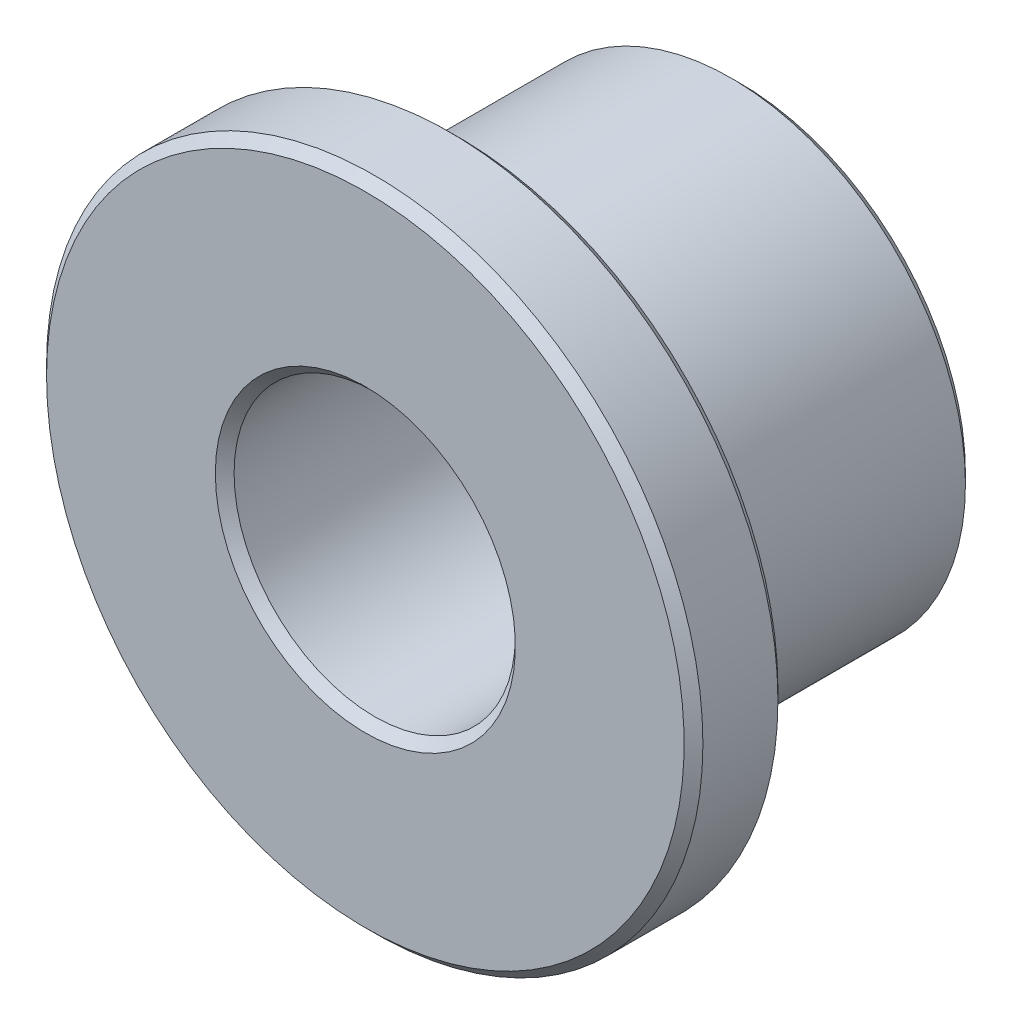
ISO-10303-21;
HEADER;
FILE_DESCRIPTION(('STEP AP214'),'2;1');
FILE_NAME('part.step','',(''),(''),'','','');
FILE_SCHEMA(('AUTOMOTIVE_DESIGN { 1 0 10303 214 1 1 1 1 }'));
ENDSEC;
DATA;
#1=APPLICATION_CONTEXT('core data for automotive mechanical design processes');
#2=APPLICATION_PROTOCOL_DEFINITION('international standard','automotive_design',2000,#1);
#3=PRODUCT_CONTEXT('',#1,'mechanical');
#4=PRODUCT('Part','Part','',(#3));
#5=PRODUCT_RELATED_PRODUCT_CATEGORY('part','',(#4));
#6=PRODUCT_DEFINITION_FORMATION('','',#4);
#7=PRODUCT_DEFINITION_CONTEXT('part definition',#1,'design');
#8=PRODUCT_DEFINITION('design','',#6,#7);
#9=PRODUCT_DEFINITION_SHAPE('','',#8);
#10=(LENGTH_UNIT() NAMED_UNIT(*) SI_UNIT(.MILLI.,.METRE.));
#11=(NAMED_UNIT(*) PLANE_ANGLE_UNIT() SI_UNIT($,.RADIAN.));
#12=(NAMED_UNIT(*) SI_UNIT($,.STERADIAN.) SOLID_ANGLE_UNIT());
#13=UNCERTAINTY_MEASURE_WITH_UNIT(LENGTH_MEASURE(1.E-05),#10,'distance_accuracy_value','');
#14=(GEOMETRIC_REPRESENTATION_CONTEXT(3) GLOBAL_UNCERTAINTY_ASSIGNED_CONTEXT((#13)) GLOBAL_UNIT_ASSIGNED_CONTEXT((#10,
#11,#12)) REPRESENTATION_CONTEXT('',''));
#15=CARTESIAN_POINT('',(0.,0.,0.));
#16=DIRECTION('',(0.,0.,1.));
#17=DIRECTION('',(1.,0.,0.));
#18=AXIS2_PLACEMENT_3D('',#15,#16,#17);
#19=CARTESIAN_POINT('',(0.,0.,0.));
#20=DIRECTION('',(0.,0.,1.));
#21=DIRECTION('',(1.,0.,0.));
#22=AXIS2_PLACEMENT_3D('',#19,#20,#21);
#23=CYLINDRICAL_SURFACE('',#22,3.);
#24=CARTESIAN_POINT('',(0.,0.,-0.200000000000001));
#25=DIRECTION('',(0.,0.,-1.));
#26=DIRECTION('',(-1.,0.,0.));
#27=AXIS2_PLACEMENT_3D('',#24,#25,#26);
#28=CIRCLE('',#27,3.);
#29=CARTESIAN_POINT('',(-3.,0.,-0.200000000000001));
#30=VERTEX_POINT('',#29);
#31=EDGE_CURVE('E10',#30,#30,#28,.F.);
#32=ORIENTED_EDGE('',*,*,#31,.T.);
#33=EDGE_LOOP('',(#32));
#34=FACE_BOUND('',#33,.T.);
#35=CARTESIAN_POINT('',(0.,0.,-7.8));
#36=DIRECTION('',(0.,0.,1.));
#37=DIRECTION('',(1.,0.,0.));
#38=AXIS2_PLACEMENT_3D('',#35,#36,#37);
#39=CIRCLE('',#38,3.);
#40=CARTESIAN_POINT('',(3.,0.,-7.8));
#41=VERTEX_POINT('',#40);
#42=EDGE_CURVE('E43',#41,#41,#39,.F.);
#43=ORIENTED_EDGE('',*,*,#42,.T.);
#44=EDGE_LOOP('',(#43));
#45=FACE_BOUND('',#44,.T.);
#46=ADVANCED_FACE('F35',(#34,#45),#23,.F.);
#47=CARTESIAN_POINT('',(0.,3.,0.));
#48=DIRECTION('',(0.,0.,-1.));
#49=DIRECTION('',(-1.,0.,0.));
#50=AXIS2_PLACEMENT_3D('',#47,#48,#49);
#51=PLANE('',#50);
#52=CARTESIAN_POINT('',(0.,0.,0.));
#53=DIRECTION('',(0.,0.,-1.));
#54=DIRECTION('',(-1.,0.,0.));
#55=AXIS2_PLACEMENT_3D('',#52,#53,#54);
#56=CIRCLE('',#55,6.8);
#57=CARTESIAN_POINT('',(-6.8,0.,0.));
#58=VERTEX_POINT('',#57);
#59=EDGE_CURVE('E62',#58,#58,#56,.F.);
#60=ORIENTED_EDGE('',*,*,#59,.T.);
#61=EDGE_LOOP('',(#60));
#62=FACE_BOUND('',#61,.T.);
#63=CARTESIAN_POINT('',(0.,0.,0.));
#64=DIRECTION('',(0.,0.,-1.));
#65=DIRECTION('',(-1.,0.,0.));
#66=AXIS2_PLACEMENT_3D('',#63,#64,#65);
#67=CIRCLE('',#66,3.2);
#68=CARTESIAN_POINT('',(-3.2,0.,0.));
#69=VERTEX_POINT('',#68);
#70=EDGE_CURVE('E65',#69,#69,#67,.T.);
#71=ORIENTED_EDGE('',*,*,#70,.T.);
#72=EDGE_LOOP('',(#71));
#73=FACE_BOUND('',#72,.T.);
#74=ADVANCED_FACE('F91',(#62,#73),#51,.F.);
#75=CARTESIAN_POINT('',(0.,0.,0.));
#76=DIRECTION('',(0.,0.,1.));
#77=DIRECTION('',(1.,0.,0.));
#78=AXIS2_PLACEMENT_3D('',#75,#76,#77);
#79=CYLINDRICAL_SURFACE('',#78,7.);
#80=CARTESIAN_POINT('',(0.,0.,-1.8));
#81=DIRECTION('',(0.,0.,1.));
#82=DIRECTION('',(1.,0.,0.));
#83=AXIS2_PLACEMENT_3D('',#80,#81,#82);
#84=CIRCLE('',#83,7.);
#85=CARTESIAN_POINT('',(7.,0.,-1.8));
#86=VERTEX_POINT('',#85);
#87=EDGE_CURVE('E74',#86,#86,#84,.T.);
#88=ORIENTED_EDGE('',*,*,#87,.T.);
#89=EDGE_LOOP('',(#88));
#90=FACE_BOUND('',#89,.T.);
#91=CARTESIAN_POINT('',(0.,0.,-0.200000000000001));
#92=DIRECTION('',(0.,0.,-1.));
#93=DIRECTION('',(-1.,0.,0.));
#94=AXIS2_PLACEMENT_3D('',#91,#92,#93);
#95=CIRCLE('',#94,7.);
#96=CARTESIAN_POINT('',(-7.,0.,-0.200000000000001));
#97=VERTEX_POINT('',#96);
#98=EDGE_CURVE('E77',#97,#97,#95,.T.);
#99=ORIENTED_EDGE('',*,*,#98,.T.);
#100=EDGE_LOOP('',(#99));
#101=FACE_BOUND('',#100,.T.);
#102=ADVANCED_FACE('F81',(#90,#101),#79,.T.);
#103=CARTESIAN_POINT('',(0.,7.,-2.));
#104=DIRECTION('',(0.,0.,1.));
#105=DIRECTION('',(1.,0.,0.));
#106=AXIS2_PLACEMENT_3D('',#103,#104,#105);
#107=PLANE('',#106);
#108=CARTESIAN_POINT('',(0.,0.,-2.));
#109=DIRECTION('',(0.,0.,1.));
#110=DIRECTION('',(1.,0.,0.));
#111=AXIS2_PLACEMENT_3D('',#108,#109,#110);
#112=CIRCLE('',#111,6.8);
#113=CARTESIAN_POINT('',(6.8,0.,-2.));
#114=VERTEX_POINT('',#113);
#115=EDGE_CURVE('E68',#114,#114,#112,.F.);
#116=ORIENTED_EDGE('',*,*,#115,.T.);
#117=EDGE_LOOP('',(#116));
#118=FACE_BOUND('',#117,.T.);
#119=CARTESIAN_POINT('',(0.,0.,-2.));
#120=DIRECTION('',(0.,0.,1.));
#121=DIRECTION('',(1.,0.,0.));
#122=AXIS2_PLACEMENT_3D('',#119,#120,#121);
#123=CIRCLE('',#122,5.2);
#124=CARTESIAN_POINT('',(5.2,0.,-2.));
#125=VERTEX_POINT('',#124);
#126=EDGE_CURVE('E71',#125,#125,#123,.T.);
#127=ORIENTED_EDGE('',*,*,#126,.T.);
#128=EDGE_LOOP('',(#127));
#129=FACE_BOUND('',#128,.T.);
#130=ADVANCED_FACE('F146',(#118,#129),#107,.F.);
#131=CARTESIAN_POINT('',(0.,0.,0.));
#132=DIRECTION('',(0.,0.,1.));
#133=DIRECTION('',(1.,0.,0.));
#134=AXIS2_PLACEMENT_3D('',#131,#132,#133);
#135=CYLINDRICAL_SURFACE('',#134,5.);
#136=CARTESIAN_POINT('',(0.,0.,-7.8));
#137=DIRECTION('',(0.,0.,1.));
#138=DIRECTION('',(1.,0.,0.));
#139=AXIS2_PLACEMENT_3D('',#136,#137,#138);
#140=CIRCLE('',#139,5.);
#141=CARTESIAN_POINT('',(5.,0.,-7.8));
#142=VERTEX_POINT('',#141);
#143=EDGE_CURVE('E56',#142,#142,#140,.T.);
#144=ORIENTED_EDGE('',*,*,#143,.T.);
#145=EDGE_LOOP('',(#144));
#146=FACE_BOUND('',#145,.T.);
#147=CARTESIAN_POINT('',(0.,0.,-2.2));
#148=DIRECTION('',(0.,0.,1.));
#149=DIRECTION('',(1.,0.,0.));
#150=AXIS2_PLACEMENT_3D('',#147,#148,#149);
#151=CIRCLE('',#150,5.);
#152=CARTESIAN_POINT('',(5.,0.,-2.2));
#153=VERTEX_POINT('',#152);
#154=EDGE_CURVE('E59',#153,#153,#151,.F.);
#155=ORIENTED_EDGE('',*,*,#154,.T.);
#156=EDGE_LOOP('',(#155));
#157=FACE_BOUND('',#156,.T.);
#158=ADVANCED_FACE('F143',(#146,#157),#135,.T.);
#159=CARTESIAN_POINT('',(0.,5.,-8.));
#160=DIRECTION('',(0.,0.,1.));
#161=DIRECTION('',(1.,0.,0.));
#162=AXIS2_PLACEMENT_3D('',#159,#160,#161);
#163=PLANE('',#162);
#164=CARTESIAN_POINT('',(0.,0.,-8.));
#165=DIRECTION('',(0.,0.,1.));
#166=DIRECTION('',(1.,0.,0.));
#167=AXIS2_PLACEMENT_3D('',#164,#165,#166);
#168=CIRCLE('',#167,4.8);
#169=CARTESIAN_POINT('',(4.8,0.,-8.));
#170=VERTEX_POINT('',#169);
#171=EDGE_CURVE('E47',#170,#170,#168,.F.);
#172=ORIENTED_EDGE('',*,*,#171,.T.);
#173=EDGE_LOOP('',(#172));
#174=FACE_BOUND('',#173,.T.);
#175=CARTESIAN_POINT('',(0.,0.,-8.));
#176=DIRECTION('',(0.,0.,1.));
#177=DIRECTION('',(1.,0.,0.));
#178=AXIS2_PLACEMENT_3D('',#175,#176,#177);
#179=CIRCLE('',#178,3.2);
#180=CARTESIAN_POINT('',(3.2,0.,-8.));
#181=VERTEX_POINT('',#180);
#182=EDGE_CURVE('E51',#181,#181,#179,.T.);
#183=ORIENTED_EDGE('',*,*,#182,.T.);
#184=EDGE_LOOP('',(#183));
#185=FACE_BOUND('',#184,.T.);
#186=ADVANCED_FACE('F120',(#174,#185),#163,.F.);
#187=CARTESIAN_POINT('',(0.,0.,-1.8));
#188=DIRECTION('',(0.,0.,1.));
#189=DIRECTION('',(1.,0.,0.));
#190=AXIS2_PLACEMENT_3D('',#187,#188,#189);
#191=CONICAL_SURFACE('',#190,7.,0.785398163397455);
#192=ORIENTED_EDGE('',*,*,#115,.F.);
#193=EDGE_LOOP('',(#192));
#194=FACE_BOUND('',#193,.T.);
#195=ORIENTED_EDGE('',*,*,#87,.F.);
#196=EDGE_LOOP('',(#195));
#197=FACE_BOUND('',#196,.T.);
#198=ADVANCED_FACE('F87',(#194,#197),#191,.T.);
#199=CARTESIAN_POINT('',(0.,0.,0.));
#200=DIRECTION('',(0.,0.,-1.));
#201=DIRECTION('',(-1.,0.,0.));
#202=AXIS2_PLACEMENT_3D('',#199,#200,#201);
#203=CONICAL_SURFACE('',#202,6.8,0.785398163397446);
#204=ORIENTED_EDGE('',*,*,#98,.F.);
#205=EDGE_LOOP('',(#204));
#206=FACE_BOUND('',#205,.T.);
#207=ORIENTED_EDGE('',*,*,#59,.F.);
#208=EDGE_LOOP('',(#207));
#209=FACE_BOUND('',#208,.T.);
#210=ADVANCED_FACE('F83',(#206,#209),#203,.T.);
#211=CARTESIAN_POINT('',(0.,0.,-7.8));
#212=DIRECTION('',(0.,0.,1.));
#213=DIRECTION('',(1.,0.,0.));
#214=AXIS2_PLACEMENT_3D('',#211,#212,#213);
#215=CONICAL_SURFACE('',#214,5.,0.785398163397448);
#216=ORIENTED_EDGE('',*,*,#171,.F.);
#217=EDGE_LOOP('',(#216));
#218=FACE_BOUND('',#217,.T.);
#219=ORIENTED_EDGE('',*,*,#143,.F.);
#220=EDGE_LOOP('',(#219));
#221=FACE_BOUND('',#220,.T.);
#222=ADVANCED_FACE('F86',(#218,#221),#215,.T.);
#223=CARTESIAN_POINT('',(0.,0.,-2.));
#224=DIRECTION('',(0.,0.,1.));
#225=DIRECTION('',(1.,0.,0.));
#226=AXIS2_PLACEMENT_3D('',#223,#224,#225);
#227=CONICAL_SURFACE('',#226,5.2,0.785398163397453);
#228=CARTESIAN_POINT('',(5.,0.,-2.2));
#229=CARTESIAN_POINT('',(5.00208333333333,0.,-2.19791666666667));
#230=CARTESIAN_POINT('',(5.00416666666667,0.,-2.19583333333333));
#231=CARTESIAN_POINT('',(5.00833333333333,0.,-2.19166666666667));
#232=CARTESIAN_POINT('',(5.01041666666667,0.,-2.18958333333333));
#233=CARTESIAN_POINT('',(5.01458333333333,0.,-2.18541666666667));
#234=CARTESIAN_POINT('',(5.01666666666667,0.,-2.18333333333333));
#235=CARTESIAN_POINT('',(5.02083333333333,0.,-2.17916666666667));
#236=CARTESIAN_POINT('',(5.02291666666667,0.,-2.17708333333333));
#237=CARTESIAN_POINT('',(5.02708333333333,0.,-2.17291666666667));
#238=CARTESIAN_POINT('',(5.02916666666667,0.,-2.17083333333333));
#239=CARTESIAN_POINT('',(5.03333333333333,0.,-2.16666666666667));
#240=CARTESIAN_POINT('',(5.03541666666667,0.,-2.16458333333333));
#241=CARTESIAN_POINT('',(5.03958333333333,0.,-2.16041666666667));
#242=CARTESIAN_POINT('',(5.04166666666667,0.,-2.15833333333333));
#243=CARTESIAN_POINT('',(5.04583333333333,0.,-2.15416666666667));
#244=CARTESIAN_POINT('',(5.04791666666667,0.,-2.15208333333333));
#245=CARTESIAN_POINT('',(5.05208333333333,0.,-2.14791666666667));
#246=CARTESIAN_POINT('',(5.05416666666667,0.,-2.14583333333333));
#247=CARTESIAN_POINT('',(5.05833333333333,0.,-2.14166666666667));
#248=CARTESIAN_POINT('',(5.06041666666667,0.,-2.13958333333333));
#249=CARTESIAN_POINT('',(5.06458333333333,0.,-2.13541666666667));
#250=CARTESIAN_POINT('',(5.06666666666667,0.,-2.13333333333333));
#251=CARTESIAN_POINT('',(5.07083333333333,0.,-2.12916666666667));
#252=CARTESIAN_POINT('',(5.07291666666667,0.,-2.12708333333333));
#253=CARTESIAN_POINT('',(5.07708333333333,0.,-2.12291666666667));
#254=CARTESIAN_POINT('',(5.07916666666667,0.,-2.12083333333333));
#255=CARTESIAN_POINT('',(5.08333333333333,0.,-2.11666666666667));
#256=CARTESIAN_POINT('',(5.08541666666667,0.,-2.11458333333333));
#257=CARTESIAN_POINT('',(5.08958333333333,0.,-2.11041666666667));
#258=CARTESIAN_POINT('',(5.09166666666667,0.,-2.10833333333333));
#259=CARTESIAN_POINT('',(5.09583333333333,0.,-2.10416666666667));
#260=CARTESIAN_POINT('',(5.09791666666667,0.,-2.10208333333333));
#261=CARTESIAN_POINT('',(5.10208333333333,0.,-2.09791666666667));
#262=CARTESIAN_POINT('',(5.10416666666667,0.,-2.09583333333333));
#263=CARTESIAN_POINT('',(5.10833333333333,0.,-2.09166666666667));
#264=CARTESIAN_POINT('',(5.11041666666667,0.,-2.08958333333333));
#265=CARTESIAN_POINT('',(5.11458333333333,0.,-2.08541666666667));
#266=CARTESIAN_POINT('',(5.11666666666667,0.,-2.08333333333333));
#267=CARTESIAN_POINT('',(5.12083333333333,0.,-2.07916666666667));
#268=CARTESIAN_POINT('',(5.12291666666667,0.,-2.07708333333333));
#269=CARTESIAN_POINT('',(5.12708333333333,0.,-2.07291666666667));
#270=CARTESIAN_POINT('',(5.12916666666667,0.,-2.07083333333333));
#271=CARTESIAN_POINT('',(5.13333333333333,0.,-2.06666666666667));
#272=CARTESIAN_POINT('',(5.13541666666667,0.,-2.06458333333333));
#273=CARTESIAN_POINT('',(5.13958333333333,0.,-2.06041666666667));
#274=CARTESIAN_POINT('',(5.14166666666667,0.,-2.05833333333333));
#275=CARTESIAN_POINT('',(5.14583333333333,0.,-2.05416666666667));
#276=CARTESIAN_POINT('',(5.14791666666667,0.,-2.05208333333333));
#277=CARTESIAN_POINT('',(5.15208333333333,0.,-2.04791666666667));
#278=CARTESIAN_POINT('',(5.15416666666667,0.,-2.04583333333333));
#279=CARTESIAN_POINT('',(5.15833333333333,0.,-2.04166666666667));
#280=CARTESIAN_POINT('',(5.16041666666667,0.,-2.03958333333333));
#281=CARTESIAN_POINT('',(5.16458333333333,0.,-2.03541666666667));
#282=CARTESIAN_POINT('',(5.16666666666667,0.,-2.03333333333333));
#283=CARTESIAN_POINT('',(5.17083333333333,0.,-2.02916666666667));
#284=CARTESIAN_POINT('',(5.17291666666667,0.,-2.02708333333333));
#285=CARTESIAN_POINT('',(5.17708333333333,0.,-2.02291666666667));
#286=CARTESIAN_POINT('',(5.17916666666667,0.,-2.02083333333333));
#287=CARTESIAN_POINT('',(5.18333333333333,0.,-2.01666666666667));
#288=CARTESIAN_POINT('',(5.18541666666667,0.,-2.01458333333333));
#289=CARTESIAN_POINT('',(5.18958333333333,0.,-2.01041666666667));
#290=CARTESIAN_POINT('',(5.19166666666667,0.,-2.00833333333333));
#291=CARTESIAN_POINT('',(5.19583333333333,0.,-2.00416666666667));
#292=CARTESIAN_POINT('',(5.19791666666667,0.,-2.00208333333333));
#293=CARTESIAN_POINT('',(5.2,0.,-2.));
#294=B_SPLINE_CURVE_WITH_KNOTS('',3,(#228,#229,#230,#231,#232,#233,#234,#235,#236,#237,#238,
#239,#240,#241,#242,#243,#244,#245,#246,#247,#248,#249,#250,#251,#252,#253,#254,#255,#256,#257,
#258,#259,#260,#261,#262,#263,#264,#265,#266,#267,#268,#269,#270,#271,#272,#273,#274,#275,#276,
#277,#278,#279,#280,#281,#282,#283,#284,#285,#286,#287,#288,#289,#290,#291,#292,#293),
.UNSPECIFIED.,.F.,.F.,(4,2,2,2,2,2,2,2,2,2,2,2,2,2,2,2,2,2,2,2,2,2,2,2,2,2,2,2,2,2,2,2,4),(0.,
0.0088388347648321,0.0176776695296636,0.0265165042944954,0.0353553390593275,0.0441941738241593,
0.0530330085889914,0.0618718433538231,0.0707106781186546,0.0795495128834867,0.0883883476483185,
0.0972271824131506,0.106066017177982,0.114904851942815,0.123743686707646,0.132582521472478,
0.14142135623731,0.150260191002142,0.159099025766974,0.167937860531806,0.176776695296638,
0.185615530061469,0.194454364826301,0.203293199591133,0.212132034355965,0.220970869120797,
0.229809703885629,0.238648538650461,0.247487373415292,0.256326208180124,0.265165042944956,
0.274003877709788,0.28284271247462),.UNSPECIFIED.);
#295=EDGE_CURVE('BSEAM100',#153,#125,#294,.T.);
#296=ORIENTED_EDGE('',*,*,#154,.F.);
#297=ORIENTED_EDGE('',*,*,#126,.F.);
#298=ORIENTED_EDGE('',*,*,#295,.T.);
#299=ORIENTED_EDGE('',*,*,#295,.F.);
#300=EDGE_LOOP('',(#296,#298,#297,#299));
#301=FACE_BOUND('',#300,.T.);
#302=ADVANCED_FACE('F100',(#301),#227,.T.);
#303=CARTESIAN_POINT('',(0.,0.,-0.200000000000001));
#304=DIRECTION('',(0.,0.,1.));
#305=DIRECTION('',(1.,0.,0.));
#306=AXIS2_PLACEMENT_3D('',#303,#304,#305);
#307=CONICAL_SURFACE('',#306,3.,0.785398163397447);
#308=ORIENTED_EDGE('',*,*,#70,.F.);
#309=EDGE_LOOP('',(#308));
#310=FACE_BOUND('',#309,.T.);
#311=ORIENTED_EDGE('',*,*,#31,.F.);
#312=EDGE_LOOP('',(#311));
#313=FACE_BOUND('',#312,.T.);
#314=ADVANCED_FACE('F97',(#310,#313),#307,.F.);
#315=CARTESIAN_POINT('',(0.,0.,-8.));
#316=DIRECTION('',(0.,0.,-1.));
#317=DIRECTION('',(-1.,0.,0.));
#318=AXIS2_PLACEMENT_3D('',#315,#316,#317);
#319=CONICAL_SURFACE('',#318,3.2,0.785398163397447);
#320=ORIENTED_EDGE('',*,*,#42,.F.);
#321=EDGE_LOOP('',(#320));
#322=FACE_BOUND('',#321,.T.);
#323=ORIENTED_EDGE('',*,*,#182,.F.);
#324=EDGE_LOOP('',(#323));
#325=FACE_BOUND('',#324,.T.);
#326=ADVANCED_FACE('F38',(#322,#325),#319,.F.);
#327=CLOSED_SHELL('',(#46,#74,#102,#130,#158,#186,#198,#210,#222,#302,#314,#326));
#328=MANIFOLD_SOLID_BREP('B2',#327);
#329=ADVANCED_BREP_SHAPE_REPRESENTATION('',(#18,#328),#14);
#330=SHAPE_DEFINITION_REPRESENTATION(#9,#329);
ENDSEC;
END-ISO-10303-21;
